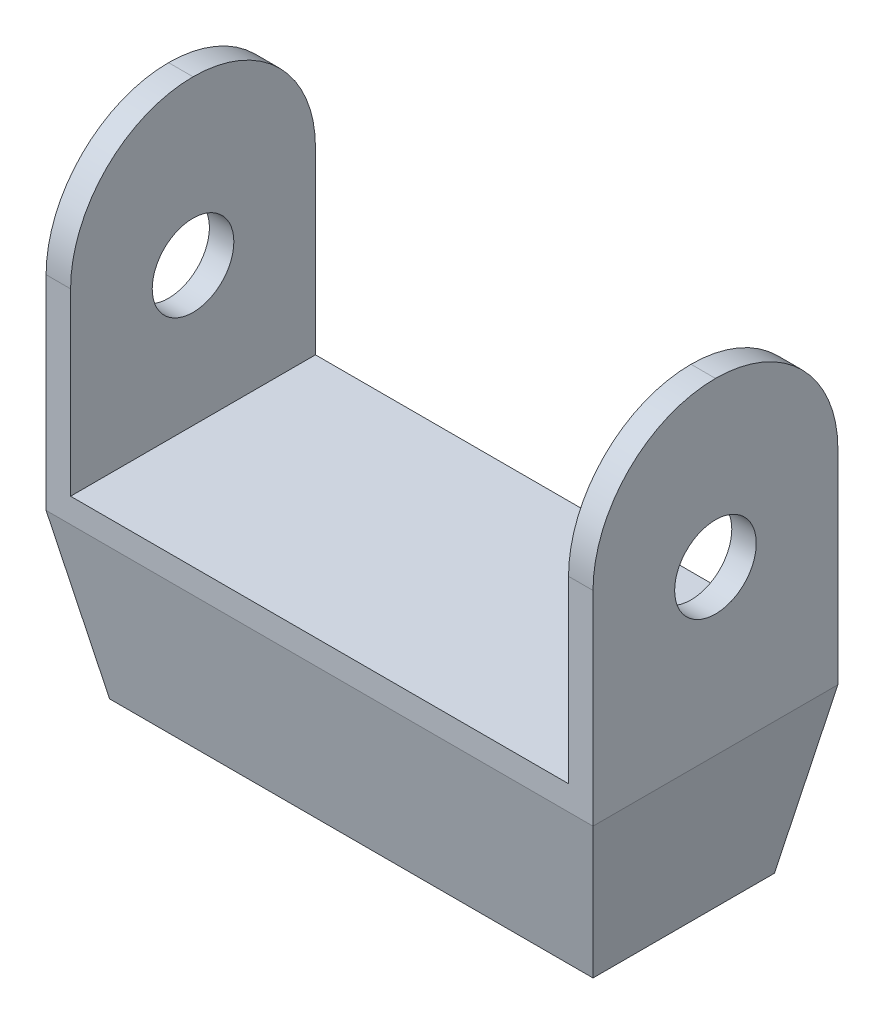
ISO-10303-21;
HEADER;
FILE_DESCRIPTION(('STEP AP214'),'2;1');
FILE_NAME('part.step','',(''),(''),'','','');
FILE_SCHEMA(('AUTOMOTIVE_DESIGN { 1 0 10303 214 1 1 1 1 }'));
ENDSEC;
DATA;
#1=APPLICATION_CONTEXT('core data for automotive mechanical design processes');
#2=APPLICATION_PROTOCOL_DEFINITION('international standard','automotive_design',2000,#1);
#3=PRODUCT_CONTEXT('',#1,'mechanical');
#4=PRODUCT('Part','Part','',(#3));
#5=PRODUCT_RELATED_PRODUCT_CATEGORY('part','',(#4));
#6=PRODUCT_DEFINITION_FORMATION('','',#4);
#7=PRODUCT_DEFINITION_CONTEXT('part definition',#1,'design');
#8=PRODUCT_DEFINITION('design','',#6,#7);
#9=PRODUCT_DEFINITION_SHAPE('','',#8);
#10=(LENGTH_UNIT() NAMED_UNIT(*) SI_UNIT(.MILLI.,.METRE.));
#11=(NAMED_UNIT(*) PLANE_ANGLE_UNIT() SI_UNIT($,.RADIAN.));
#12=(NAMED_UNIT(*) SI_UNIT($,.STERADIAN.) SOLID_ANGLE_UNIT());
#13=UNCERTAINTY_MEASURE_WITH_UNIT(LENGTH_MEASURE(1.E-05),#10,'distance_accuracy_value','');
#14=(GEOMETRIC_REPRESENTATION_CONTEXT(3) GLOBAL_UNCERTAINTY_ASSIGNED_CONTEXT((#13)) GLOBAL_UNIT_ASSIGNED_CONTEXT((#10,
#11,#12)) REPRESENTATION_CONTEXT('',''));
#15=CARTESIAN_POINT('',(0.,0.,0.));
#16=DIRECTION('',(0.,0.,1.));
#17=DIRECTION('',(1.,0.,0.));
#18=AXIS2_PLACEMENT_3D('',#15,#16,#17);
#19=CARTESIAN_POINT('',(33.5,37.,30.));
#20=DIRECTION('',(-1.,0.,0.));
#21=DIRECTION('',(0.,0.,1.));
#22=AXIS2_PLACEMENT_3D('',#19,#20,#21);
#23=PLANE('',#22);
#24=CARTESIAN_POINT('',(33.5,17.,15.));
#25=DIRECTION('',(-1.,0.,0.));
#26=DIRECTION('',(0.,0.,1.));
#27=AXIS2_PLACEMENT_3D('',#24,#25,#26);
#28=CIRCLE('',#27,5.);
#29=CARTESIAN_POINT('',(33.5,17.,20.));
#30=VERTEX_POINT('',#29);
#31=EDGE_CURVE('E254',#30,#30,#28,.T.);
#32=ORIENTED_EDGE('',*,*,#31,.T.);
#33=EDGE_LOOP('',(#32));
#34=FACE_BOUND('',#33,.T.);
#35=DIRECTION('',(0.,1.,0.));
#36=VECTOR('',#35,1.);
#37=CARTESIAN_POINT('',(33.5,37.,0.));
#38=LINE('',#37,#36);
#39=CARTESIAN_POINT('',(33.5,-3.,0.));
#40=VERTEX_POINT('',#39);
#41=CARTESIAN_POINT('',(33.5,22.,0.));
#42=VERTEX_POINT('',#41);
#43=EDGE_CURVE('E141',#40,#42,#38,.T.);
#44=ORIENTED_EDGE('',*,*,#43,.T.);
#45=CARTESIAN_POINT('',(33.5,22.,15.));
#46=DIRECTION('',(-1.,0.,0.));
#47=DIRECTION('',(0.,0.,1.));
#48=AXIS2_PLACEMENT_3D('',#45,#46,#47);
#49=CIRCLE('',#48,15.);
#50=CARTESIAN_POINT('',(33.5,37.,15.));
#51=VERTEX_POINT('',#50);
#52=EDGE_CURVE('E11',#42,#51,#49,.F.);
#53=ORIENTED_EDGE('',*,*,#52,.T.);
#54=CARTESIAN_POINT('',(33.5,22.,15.));
#55=DIRECTION('',(-1.,0.,0.));
#56=DIRECTION('',(0.,0.,1.));
#57=AXIS2_PLACEMENT_3D('',#54,#55,#56);
#58=CIRCLE('',#57,15.);
#59=CARTESIAN_POINT('',(33.5,22.,30.));
#60=VERTEX_POINT('',#59);
#61=EDGE_CURVE('E41',#51,#60,#58,.F.);
#62=ORIENTED_EDGE('',*,*,#61,.T.);
#63=DIRECTION('',(0.,1.,0.));
#64=VECTOR('',#63,1.);
#65=CARTESIAN_POINT('',(33.5,37.,30.));
#66=LINE('',#65,#64);
#67=CARTESIAN_POINT('',(33.5,-3.,30.));
#68=VERTEX_POINT('',#67);
#69=EDGE_CURVE('E169',#68,#60,#66,.T.);
#70=ORIENTED_EDGE('',*,*,#69,.F.);
#71=DIRECTION('',(0.,0.,-1.));
#72=VECTOR('',#71,1.);
#73=CARTESIAN_POINT('',(33.5,-3.,30.));
#74=LINE('',#73,#72);
#75=EDGE_CURVE('E186',#68,#40,#74,.T.);
#76=ORIENTED_EDGE('',*,*,#75,.T.);
#77=EDGE_LOOP('',(#44,#53,#62,#70,#76));
#78=FACE_BOUND('',#77,.T.);
#79=ADVANCED_FACE('F32',(#34,#78),#23,.F.);
#80=CARTESIAN_POINT('',(30.5,0.,30.));
#81=DIRECTION('',(1.,0.,0.));
#82=DIRECTION('',(0.,0.,-1.));
#83=AXIS2_PLACEMENT_3D('',#80,#81,#82);
#84=PLANE('',#83);
#85=CARTESIAN_POINT('',(30.5,17.,15.));
#86=DIRECTION('',(1.,0.,0.));
#87=DIRECTION('',(0.,0.,-1.));
#88=AXIS2_PLACEMENT_3D('',#85,#86,#87);
#89=CIRCLE('',#88,5.);
#90=CARTESIAN_POINT('',(30.5,17.,10.));
#91=VERTEX_POINT('',#90);
#92=EDGE_CURVE('E251',#91,#91,#89,.T.);
#93=ORIENTED_EDGE('',*,*,#92,.T.);
#94=EDGE_LOOP('',(#93));
#95=FACE_BOUND('',#94,.T.);
#96=CARTESIAN_POINT('',(30.5,22.,15.));
#97=DIRECTION('',(1.,0.,0.));
#98=DIRECTION('',(0.,0.,-1.));
#99=AXIS2_PLACEMENT_3D('',#96,#97,#98);
#100=CIRCLE('',#99,15.);
#101=CARTESIAN_POINT('',(30.5,22.,30.));
#102=VERTEX_POINT('',#101);
#103=CARTESIAN_POINT('',(30.5,37.,15.));
#104=VERTEX_POINT('',#103);
#105=EDGE_CURVE('E55',#102,#104,#100,.F.);
#106=ORIENTED_EDGE('',*,*,#105,.T.);
#107=CARTESIAN_POINT('',(30.5,22.,15.));
#108=DIRECTION('',(1.,0.,0.));
#109=DIRECTION('',(0.,0.,-1.));
#110=AXIS2_PLACEMENT_3D('',#107,#108,#109);
#111=CIRCLE('',#110,15.);
#112=CARTESIAN_POINT('',(30.5,22.,0.));
#113=VERTEX_POINT('',#112);
#114=EDGE_CURVE('E205',#104,#113,#111,.F.);
#115=ORIENTED_EDGE('',*,*,#114,.T.);
#116=DIRECTION('',(0.,-1.,0.));
#117=VECTOR('',#116,1.);
#118=CARTESIAN_POINT('',(30.5,0.,0.));
#119=LINE('',#118,#117);
#120=CARTESIAN_POINT('',(30.5,0.,0.));
#121=VERTEX_POINT('',#120);
#122=EDGE_CURVE('E180',#113,#121,#119,.T.);
#123=ORIENTED_EDGE('',*,*,#122,.T.);
#124=DIRECTION('',(0.,0.,-1.));
#125=VECTOR('',#124,1.);
#126=CARTESIAN_POINT('',(30.5,0.,30.));
#127=LINE('',#126,#125);
#128=CARTESIAN_POINT('',(30.5,0.,30.));
#129=VERTEX_POINT('',#128);
#130=EDGE_CURVE('E177',#129,#121,#127,.T.);
#131=ORIENTED_EDGE('',*,*,#130,.F.);
#132=DIRECTION('',(0.,-1.,0.));
#133=VECTOR('',#132,1.);
#134=CARTESIAN_POINT('',(30.5,0.,30.));
#135=LINE('',#134,#133);
#136=EDGE_CURVE('E173',#102,#129,#135,.T.);
#137=ORIENTED_EDGE('',*,*,#136,.F.);
#138=EDGE_LOOP('',(#106,#115,#123,#131,#137));
#139=FACE_BOUND('',#138,.T.);
#140=ADVANCED_FACE('F269',(#95,#139),#84,.F.);
#141=CARTESIAN_POINT('',(0.,0.,30.));
#142=DIRECTION('',(0.,-1.,0.));
#143=DIRECTION('',(0.,0.,-1.));
#144=AXIS2_PLACEMENT_3D('',#141,#142,#143);
#145=PLANE('',#144);
#146=DIRECTION('',(-1.,0.,0.));
#147=VECTOR('',#146,1.);
#148=CARTESIAN_POINT('',(0.,0.,0.));
#149=LINE('',#148,#147);
#150=CARTESIAN_POINT('',(-30.5,0.,0.));
#151=VERTEX_POINT('',#150);
#152=EDGE_CURVE('E170',#121,#151,#149,.T.);
#153=ORIENTED_EDGE('',*,*,#152,.T.);
#154=DIRECTION('',(0.,0.,-1.));
#155=VECTOR('',#154,1.);
#156=CARTESIAN_POINT('',(-30.5,0.,30.));
#157=LINE('',#156,#155);
#158=CARTESIAN_POINT('',(-30.5,0.,30.));
#159=VERTEX_POINT('',#158);
#160=EDGE_CURVE('E145',#159,#151,#157,.T.);
#161=ORIENTED_EDGE('',*,*,#160,.F.);
#162=DIRECTION('',(-1.,0.,0.));
#163=VECTOR('',#162,1.);
#164=CARTESIAN_POINT('',(0.,0.,30.));
#165=LINE('',#164,#163);
#166=EDGE_CURVE('E175',#129,#159,#165,.T.);
#167=ORIENTED_EDGE('',*,*,#166,.F.);
#168=ORIENTED_EDGE('',*,*,#130,.T.);
#169=EDGE_LOOP('',(#153,#161,#167,#168));
#170=FACE_BOUND('',#169,.T.);
#171=ADVANCED_FACE('F264',(#170),#145,.F.);
#172=CARTESIAN_POINT('',(0.,0.,30.));
#173=DIRECTION('',(0.,0.,-1.));
#174=DIRECTION('',(-1.,0.,0.));
#175=AXIS2_PLACEMENT_3D('',#172,#173,#174);
#176=PLANE('',#175);
#177=DIRECTION('',(0.,-1.,0.));
#178=VECTOR('',#177,1.);
#179=CARTESIAN_POINT('',(-30.5,0.,30.));
#180=LINE('',#179,#178);
#181=CARTESIAN_POINT('',(-30.5,22.,30.));
#182=VERTEX_POINT('',#181);
#183=EDGE_CURVE('E132',#182,#159,#180,.T.);
#184=ORIENTED_EDGE('',*,*,#183,.F.);
#185=DIRECTION('',(1.,0.,0.));
#186=VECTOR('',#185,1.);
#187=CARTESIAN_POINT('',(-33.5,22.,30.));
#188=LINE('',#187,#186);
#189=CARTESIAN_POINT('',(-33.5,22.,30.));
#190=VERTEX_POINT('',#189);
#191=EDGE_CURVE('E194',#182,#190,#188,.F.);
#192=ORIENTED_EDGE('',*,*,#191,.T.);
#193=DIRECTION('',(0.,1.,0.));
#194=VECTOR('',#193,1.);
#195=CARTESIAN_POINT('',(-33.5,37.,30.));
#196=LINE('',#195,#194);
#197=CARTESIAN_POINT('',(-33.5,-3.,30.));
#198=VERTEX_POINT('',#197);
#199=EDGE_CURVE('E160',#198,#190,#196,.T.);
#200=ORIENTED_EDGE('',*,*,#199,.F.);
#201=DIRECTION('',(1.,0.,0.));
#202=VECTOR('',#201,1.);
#203=CARTESIAN_POINT('',(33.5,-3.,30.));
#204=LINE('',#203,#202);
#205=EDGE_CURVE('E167',#198,#68,#204,.T.);
#206=ORIENTED_EDGE('',*,*,#205,.T.);
#207=ORIENTED_EDGE('',*,*,#69,.T.);
#208=DIRECTION('',(-1.,0.,0.));
#209=VECTOR('',#208,1.);
#210=CARTESIAN_POINT('',(0.,22.,30.));
#211=LINE('',#210,#209);
#212=EDGE_CURVE('E192',#60,#102,#211,.T.);
#213=ORIENTED_EDGE('',*,*,#212,.T.);
#214=ORIENTED_EDGE('',*,*,#136,.T.);
#215=ORIENTED_EDGE('',*,*,#166,.T.);
#216=EDGE_LOOP('',(#184,#192,#200,#206,#207,#213,#214,#215));
#217=FACE_BOUND('',#216,.T.);
#218=ADVANCED_FACE('F227',(#217),#176,.F.);
#219=CARTESIAN_POINT('',(0.,0.,0.));
#220=DIRECTION('',(0.,0.,-1.));
#221=DIRECTION('',(-1.,0.,0.));
#222=AXIS2_PLACEMENT_3D('',#219,#220,#221);
#223=PLANE('',#222);
#224=DIRECTION('',(0.,1.,0.));
#225=VECTOR('',#224,1.);
#226=CARTESIAN_POINT('',(-33.5,37.,0.));
#227=LINE('',#226,#225);
#228=CARTESIAN_POINT('',(-33.5,-3.,0.));
#229=VERTEX_POINT('',#228);
#230=CARTESIAN_POINT('',(-33.5,22.,0.));
#231=VERTEX_POINT('',#230);
#232=EDGE_CURVE('E121',#229,#231,#227,.T.);
#233=ORIENTED_EDGE('',*,*,#232,.T.);
#234=DIRECTION('',(1.,0.,0.));
#235=VECTOR('',#234,1.);
#236=CARTESIAN_POINT('',(0.,22.,0.));
#237=LINE('',#236,#235);
#238=CARTESIAN_POINT('',(-30.5,22.,0.));
#239=VERTEX_POINT('',#238);
#240=EDGE_CURVE('E202',#231,#239,#237,.T.);
#241=ORIENTED_EDGE('',*,*,#240,.T.);
#242=DIRECTION('',(0.,-1.,0.));
#243=VECTOR('',#242,1.);
#244=CARTESIAN_POINT('',(-30.5,0.,0.));
#245=LINE('',#244,#243);
#246=EDGE_CURVE('E133',#239,#151,#245,.T.);
#247=ORIENTED_EDGE('',*,*,#246,.T.);
#248=ORIENTED_EDGE('',*,*,#152,.F.);
#249=ORIENTED_EDGE('',*,*,#122,.F.);
#250=DIRECTION('',(-1.,0.,0.));
#251=VECTOR('',#250,1.);
#252=CARTESIAN_POINT('',(33.5,22.,0.));
#253=LINE('',#252,#251);
#254=EDGE_CURVE('E200',#113,#42,#253,.F.);
#255=ORIENTED_EDGE('',*,*,#254,.T.);
#256=ORIENTED_EDGE('',*,*,#43,.F.);
#257=DIRECTION('',(1.,0.,0.));
#258=VECTOR('',#257,1.);
#259=CARTESIAN_POINT('',(33.5,-3.,0.));
#260=LINE('',#259,#258);
#261=EDGE_CURVE('E137',#229,#40,#260,.T.);
#262=ORIENTED_EDGE('',*,*,#261,.F.);
#263=EDGE_LOOP('',(#233,#241,#247,#248,#249,#255,#256,#262));
#264=FACE_BOUND('',#263,.T.);
#265=ADVANCED_FACE('F139',(#264),#223,.T.);
#266=CARTESIAN_POINT('',(-30.5,0.,30.));
#267=DIRECTION('',(1.,0.,0.));
#268=DIRECTION('',(0.,0.,-1.));
#269=AXIS2_PLACEMENT_3D('',#266,#267,#268);
#270=PLANE('',#269);
#271=CARTESIAN_POINT('',(-30.5,17.,15.));
#272=DIRECTION('',(1.,0.,0.));
#273=DIRECTION('',(0.,0.,-1.));
#274=AXIS2_PLACEMENT_3D('',#271,#272,#273);
#275=CIRCLE('',#274,5.);
#276=CARTESIAN_POINT('',(-30.5,17.,10.));
#277=VERTEX_POINT('',#276);
#278=EDGE_CURVE('E214',#277,#277,#275,.T.);
#279=ORIENTED_EDGE('',*,*,#278,.F.);
#280=EDGE_LOOP('',(#279));
#281=FACE_BOUND('',#280,.T.);
#282=CARTESIAN_POINT('',(-30.5,22.,15.));
#283=DIRECTION('',(1.,0.,0.));
#284=DIRECTION('',(0.,0.,-1.));
#285=AXIS2_PLACEMENT_3D('',#282,#283,#284);
#286=CIRCLE('',#285,15.);
#287=CARTESIAN_POINT('',(-30.5,37.,15.));
#288=VERTEX_POINT('',#287);
#289=EDGE_CURVE('E188',#239,#288,#286,.T.);
#290=ORIENTED_EDGE('',*,*,#289,.T.);
#291=CARTESIAN_POINT('',(-30.5,22.,15.));
#292=DIRECTION('',(1.,0.,0.));
#293=DIRECTION('',(0.,0.,-1.));
#294=AXIS2_PLACEMENT_3D('',#291,#292,#293);
#295=CIRCLE('',#294,15.);
#296=EDGE_CURVE('E190',#288,#182,#295,.T.);
#297=ORIENTED_EDGE('',*,*,#296,.T.);
#298=ORIENTED_EDGE('',*,*,#183,.T.);
#299=ORIENTED_EDGE('',*,*,#160,.T.);
#300=ORIENTED_EDGE('',*,*,#246,.F.);
#301=EDGE_LOOP('',(#290,#297,#298,#299,#300));
#302=FACE_BOUND('',#301,.T.);
#303=ADVANCED_FACE('F267',(#281,#302),#270,.T.);
#304=CARTESIAN_POINT('',(-33.5,37.,30.));
#305=DIRECTION('',(-1.,0.,0.));
#306=DIRECTION('',(0.,0.,1.));
#307=AXIS2_PLACEMENT_3D('',#304,#305,#306);
#308=PLANE('',#307);
#309=CARTESIAN_POINT('',(-33.5,17.,15.));
#310=DIRECTION('',(-1.,0.,0.));
#311=DIRECTION('',(0.,0.,1.));
#312=AXIS2_PLACEMENT_3D('',#309,#310,#311);
#313=CIRCLE('',#312,5.);
#314=CARTESIAN_POINT('',(-33.5,17.,20.));
#315=VERTEX_POINT('',#314);
#316=EDGE_CURVE('E209',#315,#315,#313,.T.);
#317=ORIENTED_EDGE('',*,*,#316,.F.);
#318=EDGE_LOOP('',(#317));
#319=FACE_BOUND('',#318,.T.);
#320=ORIENTED_EDGE('',*,*,#199,.T.);
#321=CARTESIAN_POINT('',(-33.5,22.,15.));
#322=DIRECTION('',(-1.,0.,0.));
#323=DIRECTION('',(0.,0.,1.));
#324=AXIS2_PLACEMENT_3D('',#321,#322,#323);
#325=CIRCLE('',#324,15.);
#326=CARTESIAN_POINT('',(-33.5,37.,15.));
#327=VERTEX_POINT('',#326);
#328=EDGE_CURVE('E198',#190,#327,#325,.T.);
#329=ORIENTED_EDGE('',*,*,#328,.T.);
#330=CARTESIAN_POINT('',(-33.5,22.,15.));
#331=DIRECTION('',(-1.,0.,0.));
#332=DIRECTION('',(0.,0.,1.));
#333=AXIS2_PLACEMENT_3D('',#330,#331,#332);
#334=CIRCLE('',#333,15.);
#335=EDGE_CURVE('E129',#327,#231,#334,.T.);
#336=ORIENTED_EDGE('',*,*,#335,.T.);
#337=ORIENTED_EDGE('',*,*,#232,.F.);
#338=DIRECTION('',(0.,0.,-1.));
#339=VECTOR('',#338,1.);
#340=CARTESIAN_POINT('',(-33.5,-3.,30.));
#341=LINE('',#340,#339);
#342=EDGE_CURVE('E126',#198,#229,#341,.T.);
#343=ORIENTED_EDGE('',*,*,#342,.F.);
#344=EDGE_LOOP('',(#320,#329,#336,#337,#343));
#345=FACE_BOUND('',#344,.T.);
#346=ADVANCED_FACE('F124',(#319,#345),#308,.T.);
#347=CARTESIAN_POINT('',(56.5,17.,15.));
#348=DIRECTION('',(-1.,0.,0.));
#349=DIRECTION('',(0.,0.,1.));
#350=AXIS2_PLACEMENT_3D('',#347,#348,#349);
#351=CYLINDRICAL_SURFACE('',#350,5.);
#352=ORIENTED_EDGE('',*,*,#278,.T.);
#353=EDGE_LOOP('',(#352));
#354=FACE_BOUND('',#353,.T.);
#355=ORIENTED_EDGE('',*,*,#316,.T.);
#356=EDGE_LOOP('',(#355));
#357=FACE_BOUND('',#356,.T.);
#358=ADVANCED_FACE('F326',(#354,#357),#351,.F.);
#359=ORIENTED_EDGE('',*,*,#92,.F.);
#360=EDGE_LOOP('',(#359));
#361=FACE_BOUND('',#360,.T.);
#362=ORIENTED_EDGE('',*,*,#31,.F.);
#363=EDGE_LOOP('',(#362));
#364=FACE_BOUND('',#363,.T.);
#365=ADVANCED_FACE('F302',(#361,#364),#351,.F.);
#366=CARTESIAN_POINT('',(0.,22.,15.));
#367=DIRECTION('',(1.,0.,0.));
#368=DIRECTION('',(0.,0.,-1.));
#369=AXIS2_PLACEMENT_3D('',#366,#367,#368);
#370=CYLINDRICAL_SURFACE('',#369,15.);
#371=ORIENTED_EDGE('',*,*,#240,.F.);
#372=ORIENTED_EDGE('',*,*,#335,.F.);
#373=DIRECTION('',(1.,0.,0.));
#374=VECTOR('',#373,1.);
#375=CARTESIAN_POINT('',(-30.5,37.,15.));
#376=LINE('',#375,#374);
#377=EDGE_CURVE('E207',#288,#327,#376,.F.);
#378=ORIENTED_EDGE('',*,*,#377,.F.);
#379=ORIENTED_EDGE('',*,*,#289,.F.);
#380=EDGE_LOOP('',(#371,#372,#378,#379));
#381=FACE_BOUND('',#380,.T.);
#382=ADVANCED_FACE('F300',(#381),#370,.T.);
#383=CARTESIAN_POINT('',(-30.5,22.,15.));
#384=DIRECTION('',(-1.,0.,0.));
#385=DIRECTION('',(0.,0.,1.));
#386=AXIS2_PLACEMENT_3D('',#383,#384,#385);
#387=CYLINDRICAL_SURFACE('',#386,15.);
#388=ORIENTED_EDGE('',*,*,#328,.F.);
#389=ORIENTED_EDGE('',*,*,#191,.F.);
#390=ORIENTED_EDGE('',*,*,#296,.F.);
#391=ORIENTED_EDGE('',*,*,#377,.T.);
#392=EDGE_LOOP('',(#388,#389,#390,#391));
#393=FACE_BOUND('',#392,.T.);
#394=ADVANCED_FACE('F297',(#393),#387,.T.);
#395=CARTESIAN_POINT('',(0.,22.,15.));
#396=DIRECTION('',(-1.,0.,0.));
#397=DIRECTION('',(0.,0.,1.));
#398=AXIS2_PLACEMENT_3D('',#395,#396,#397);
#399=CYLINDRICAL_SURFACE('',#398,15.);
#400=ORIENTED_EDGE('',*,*,#212,.F.);
#401=ORIENTED_EDGE('',*,*,#61,.F.);
#402=DIRECTION('',(-1.,0.,0.));
#403=VECTOR('',#402,1.);
#404=CARTESIAN_POINT('',(30.5,37.,15.));
#405=LINE('',#404,#403);
#406=EDGE_CURVE('E36',#104,#51,#405,.F.);
#407=ORIENTED_EDGE('',*,*,#406,.F.);
#408=ORIENTED_EDGE('',*,*,#105,.F.);
#409=EDGE_LOOP('',(#400,#401,#407,#408));
#410=FACE_BOUND('',#409,.T.);
#411=ADVANCED_FACE('F34',(#410),#399,.T.);
#412=CARTESIAN_POINT('',(30.5,22.,15.));
#413=DIRECTION('',(1.,0.,0.));
#414=DIRECTION('',(0.,0.,-1.));
#415=AXIS2_PLACEMENT_3D('',#412,#413,#414);
#416=CYLINDRICAL_SURFACE('',#415,15.);
#417=ORIENTED_EDGE('',*,*,#52,.F.);
#418=ORIENTED_EDGE('',*,*,#254,.F.);
#419=ORIENTED_EDGE('',*,*,#114,.F.);
#420=ORIENTED_EDGE('',*,*,#406,.T.);
#421=EDGE_LOOP('',(#417,#418,#419,#420));
#422=FACE_BOUND('',#421,.T.);
#423=ADVANCED_FACE('F219',(#422),#416,.T.);
#424=CARTESIAN_POINT('',(-33.5,-3.,30.));
#425=DIRECTION('',(-0.981627183447664,-0.190808995376545,0.));
#426=DIRECTION('',(0.190808995376545,-0.981627183447664,0.));
#427=AXIS2_PLACEMENT_3D('',#424,#425,#426);
#428=PLANE('',#427);
#429=ORIENTED_EDGE('',*,*,#342,.T.);
#430=DIRECTION('',(-0.187427559991896,0.964231206459824,-0.187427559991896));
#431=VECTOR('',#430,1.);
#432=CARTESIAN_POINT('',(-33.5,-3.,0.));
#433=LINE('',#432,#431);
#434=CARTESIAN_POINT('',(-29.6123938172456,-23.,3.88760618275438));
#435=VERTEX_POINT('',#434);
#436=EDGE_CURVE('E148',#435,#229,#433,.T.);
#437=ORIENTED_EDGE('',*,*,#436,.F.);
#438=DIRECTION('',(0.,0.,1.));
#439=VECTOR('',#438,1.);
#440=CARTESIAN_POINT('',(-29.6123938172456,-23.,30.));
#441=LINE('',#440,#439);
#442=CARTESIAN_POINT('',(-29.6123938172456,-23.,26.1123938172456));
#443=VERTEX_POINT('',#442);
#444=EDGE_CURVE('E242',#443,#435,#441,.F.);
#445=ORIENTED_EDGE('',*,*,#444,.F.);
#446=DIRECTION('',(-0.187427559991896,0.964231206459824,0.187427559991896));
#447=VECTOR('',#446,1.);
#448=CARTESIAN_POINT('',(-33.5,-3.,30.));
#449=LINE('',#448,#447);
#450=EDGE_CURVE('E159',#443,#198,#449,.T.);
#451=ORIENTED_EDGE('',*,*,#450,.T.);
#452=EDGE_LOOP('',(#429,#437,#445,#451));
#453=FACE_BOUND('',#452,.T.);
#454=ADVANCED_FACE('F157',(#453),#428,.T.);
#455=CARTESIAN_POINT('',(-33.5,-3.,0.));
#456=DIRECTION('',(0.,-0.190808995376545,-0.981627183447664));
#457=DIRECTION('',(0.,0.981627183447664,-0.190808995376545));
#458=AXIS2_PLACEMENT_3D('',#455,#456,#457);
#459=PLANE('',#458);
#460=ORIENTED_EDGE('',*,*,#261,.T.);
#461=DIRECTION('',(0.187427559991896,0.964231206459825,-0.187427559991896));
#462=VECTOR('',#461,1.);
#463=CARTESIAN_POINT('',(33.5,-3.,0.));
#464=LINE('',#463,#462);
#465=CARTESIAN_POINT('',(29.6123938172456,-23.,3.88760618275438));
#466=VERTEX_POINT('',#465);
#467=EDGE_CURVE('E154',#466,#40,#464,.T.);
#468=ORIENTED_EDGE('',*,*,#467,.F.);
#469=DIRECTION('',(-1.,0.,0.));
#470=VECTOR('',#469,1.);
#471=CARTESIAN_POINT('',(-33.5,-23.,3.88760618275437));
#472=LINE('',#471,#470);
#473=EDGE_CURVE('E150',#435,#466,#472,.F.);
#474=ORIENTED_EDGE('',*,*,#473,.F.);
#475=ORIENTED_EDGE('',*,*,#436,.T.);
#476=EDGE_LOOP('',(#460,#468,#474,#475));
#477=FACE_BOUND('',#476,.T.);
#478=ADVANCED_FACE('F149',(#477),#459,.T.);
#479=CARTESIAN_POINT('',(33.5,-3.,0.));
#480=DIRECTION('',(0.981627183447664,-0.190808995376545,0.));
#481=DIRECTION('',(0.190808995376545,0.981627183447664,0.));
#482=AXIS2_PLACEMENT_3D('',#479,#480,#481);
#483=PLANE('',#482);
#484=ORIENTED_EDGE('',*,*,#75,.F.);
#485=DIRECTION('',(0.187427559991896,0.964231206459825,0.187427559991896));
#486=VECTOR('',#485,1.);
#487=CARTESIAN_POINT('',(33.5,-3.,30.));
#488=LINE('',#487,#486);
#489=CARTESIAN_POINT('',(29.6123938172456,-23.,26.1123938172456));
#490=VERTEX_POINT('',#489);
#491=EDGE_CURVE('E234',#490,#68,#488,.T.);
#492=ORIENTED_EDGE('',*,*,#491,.F.);
#493=DIRECTION('',(0.,0.,-1.));
#494=VECTOR('',#493,1.);
#495=CARTESIAN_POINT('',(29.6123938172456,-23.,0.));
#496=LINE('',#495,#494);
#497=EDGE_CURVE('E246',#466,#490,#496,.F.);
#498=ORIENTED_EDGE('',*,*,#497,.F.);
#499=ORIENTED_EDGE('',*,*,#467,.T.);
#500=EDGE_LOOP('',(#484,#492,#498,#499));
#501=FACE_BOUND('',#500,.T.);
#502=ADVANCED_FACE('F270',(#501),#483,.T.);
#503=CARTESIAN_POINT('',(33.5,-3.,30.));
#504=DIRECTION('',(0.,-0.190808995376545,0.981627183447664));
#505=DIRECTION('',(0.,-0.981627183447664,-0.190808995376545));
#506=AXIS2_PLACEMENT_3D('',#503,#504,#505);
#507=PLANE('',#506);
#508=ORIENTED_EDGE('',*,*,#205,.F.);
#509=ORIENTED_EDGE('',*,*,#450,.F.);
#510=DIRECTION('',(1.,0.,0.));
#511=VECTOR('',#510,1.);
#512=CARTESIAN_POINT('',(33.5,-23.,26.1123938172456));
#513=LINE('',#512,#511);
#514=EDGE_CURVE('E235',#490,#443,#513,.F.);
#515=ORIENTED_EDGE('',*,*,#514,.F.);
#516=ORIENTED_EDGE('',*,*,#491,.T.);
#517=EDGE_LOOP('',(#508,#509,#515,#516));
#518=FACE_BOUND('',#517,.T.);
#519=ADVANCED_FACE('F231',(#518),#507,.T.);
#520=CARTESIAN_POINT('',(0.,-23.,0.));
#521=DIRECTION('',(0.,-1.,0.));
#522=DIRECTION('',(1.,0.,0.));
#523=AXIS2_PLACEMENT_3D('',#520,#521,#522);
#524=PLANE('',#523);
#525=CARTESIAN_POINT('',(0.,-23.,15.));
#526=DIRECTION('',(0.,-1.,0.));
#527=DIRECTION('',(1.,0.,0.));
#528=AXIS2_PLACEMENT_3D('',#525,#526,#527);
#529=CIRCLE('',#528,5.);
#530=CARTESIAN_POINT('',(5.00000000000001,-23.,15.));
#531=VERTEX_POINT('',#530);
#532=EDGE_CURVE('E453',#531,#531,#529,.T.);
#533=ORIENTED_EDGE('',*,*,#532,.F.);
#534=EDGE_LOOP('',(#533));
#535=FACE_BOUND('',#534,.T.);
#536=ORIENTED_EDGE('',*,*,#444,.T.);
#537=ORIENTED_EDGE('',*,*,#473,.T.);
#538=ORIENTED_EDGE('',*,*,#497,.T.);
#539=ORIENTED_EDGE('',*,*,#514,.T.);
#540=EDGE_LOOP('',(#536,#537,#538,#539));
#541=FACE_BOUND('',#540,.T.);
#542=ADVANCED_FACE('F272',(#535,#541),#524,.T.);
#543=CARTESIAN_POINT('',(0.,-18.,15.));
#544=DIRECTION('',(0.,-1.,0.));
#545=DIRECTION('',(1.,0.,0.));
#546=AXIS2_PLACEMENT_3D('',#543,#544,#545);
#547=CYLINDRICAL_SURFACE('',#546,5.);
#548=CARTESIAN_POINT('',(0.,-18.,15.));
#549=DIRECTION('',(0.,-1.,0.));
#550=DIRECTION('',(1.,0.,0.));
#551=AXIS2_PLACEMENT_3D('',#548,#549,#550);
#552=CIRCLE('',#551,5.);
#553=CARTESIAN_POINT('',(5.00000000000001,-18.,15.));
#554=VERTEX_POINT('',#553);
#555=EDGE_CURVE('E244',#554,#554,#552,.T.);
#556=ORIENTED_EDGE('',*,*,#555,.F.);
#557=EDGE_LOOP('',(#556));
#558=FACE_BOUND('',#557,.T.);
#559=ORIENTED_EDGE('',*,*,#532,.T.);
#560=EDGE_LOOP('',(#559));
#561=FACE_BOUND('',#560,.T.);
#562=ADVANCED_FACE('F274',(#558,#561),#547,.F.);
#563=CARTESIAN_POINT('',(0.,-18.,15.));
#564=DIRECTION('',(0.,-1.,0.));
#565=DIRECTION('',(1.,0.,0.));
#566=AXIS2_PLACEMENT_3D('',#563,#564,#565);
#567=PLANE('',#566);
#568=ORIENTED_EDGE('',*,*,#555,.T.);
#569=EDGE_LOOP('',(#568));
#570=FACE_BOUND('',#569,.T.);
#571=ADVANCED_FACE('F281',(#570),#567,.T.);
#572=CLOSED_SHELL('',(#79,#140,#171,#218,#265,#303,#346,#358,#365,#382,#394,#411,#423,#454,#478,
#502,#519,#542,#562,#571));
#573=MANIFOLD_SOLID_BREP('B2',#572);
#574=ADVANCED_BREP_SHAPE_REPRESENTATION('',(#18,#573),#14);
#575=SHAPE_DEFINITION_REPRESENTATION(#9,#574);
ENDSEC;
END-ISO-10303-21;
